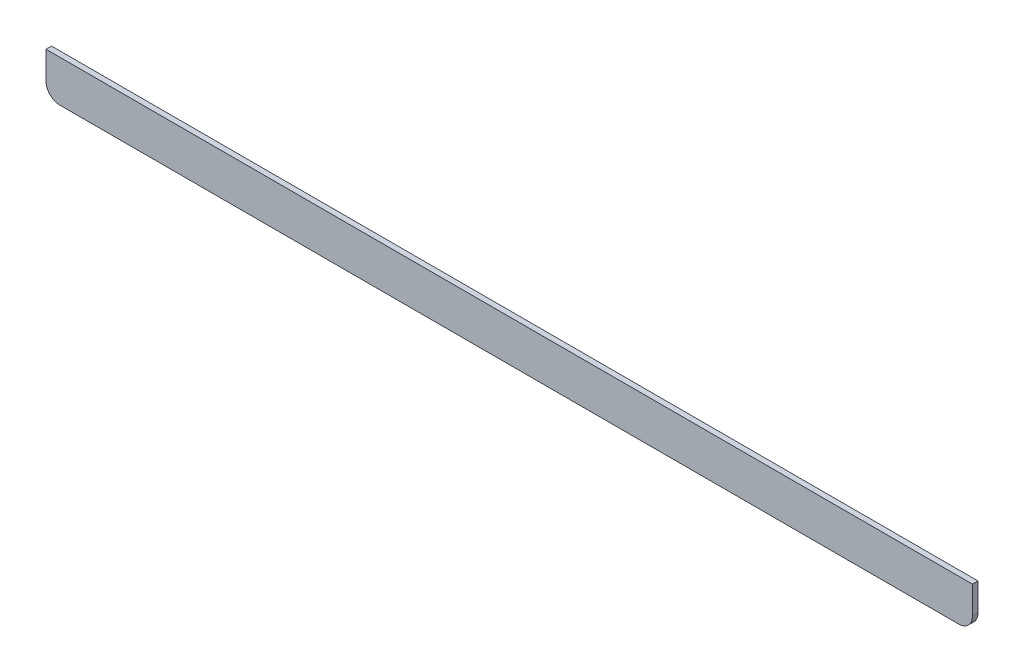
ISO-10303-21;
HEADER;
FILE_DESCRIPTION(('STEP AP214'),'2;1');
FILE_NAME('part.step','',(''),(''),'','','');
FILE_SCHEMA(('AUTOMOTIVE_DESIGN { 1 0 10303 214 1 1 1 1 }'));
ENDSEC;
DATA;
#1=APPLICATION_CONTEXT('core data for automotive mechanical design processes');
#2=APPLICATION_PROTOCOL_DEFINITION('international standard','automotive_design',2000,#1);
#3=PRODUCT_CONTEXT('',#1,'mechanical');
#4=PRODUCT('Part','Part','',(#3));
#5=PRODUCT_RELATED_PRODUCT_CATEGORY('part','',(#4));
#6=PRODUCT_DEFINITION_FORMATION('','',#4);
#7=PRODUCT_DEFINITION_CONTEXT('part definition',#1,'design');
#8=PRODUCT_DEFINITION('design','',#6,#7);
#9=PRODUCT_DEFINITION_SHAPE('','',#8);
#10=(LENGTH_UNIT() NAMED_UNIT(*) SI_UNIT(.MILLI.,.METRE.));
#11=(NAMED_UNIT(*) PLANE_ANGLE_UNIT() SI_UNIT($,.RADIAN.));
#12=(NAMED_UNIT(*) SI_UNIT($,.STERADIAN.) SOLID_ANGLE_UNIT());
#13=UNCERTAINTY_MEASURE_WITH_UNIT(LENGTH_MEASURE(1.E-05),#10,'distance_accuracy_value','');
#14=(GEOMETRIC_REPRESENTATION_CONTEXT(3) GLOBAL_UNCERTAINTY_ASSIGNED_CONTEXT((#13)) GLOBAL_UNIT_ASSIGNED_CONTEXT((#10,
#11,#12)) REPRESENTATION_CONTEXT('',''));
#15=CARTESIAN_POINT('',(0.,0.,0.));
#16=DIRECTION('',(0.,0.,1.));
#17=DIRECTION('',(1.,0.,0.));
#18=AXIS2_PLACEMENT_3D('',#15,#16,#17);
#19=CARTESIAN_POINT('',(335.,-15.,4.));
#20=DIRECTION('',(-1.,0.,0.));
#21=DIRECTION('',(0.,0.,1.));
#22=AXIS2_PLACEMENT_3D('',#19,#20,#21);
#23=PLANE('',#22);
#24=DIRECTION('',(0.,1.,0.));
#25=VECTOR('',#24,1.);
#26=CARTESIAN_POINT('',(335.,-15.,4.));
#27=LINE('',#26,#25);
#28=CARTESIAN_POINT('',(335.,-5.,4.));
#29=VERTEX_POINT('',#28);
#30=CARTESIAN_POINT('',(335.,15.,4.));
#31=VERTEX_POINT('',#30);
#32=EDGE_CURVE('E87',#29,#31,#27,.T.);
#33=ORIENTED_EDGE('',*,*,#32,.F.);
#34=DIRECTION('',(0.,0.,-1.));
#35=VECTOR('',#34,1.);
#36=CARTESIAN_POINT('',(335.,-5.,4.));
#37=LINE('',#36,#35);
#38=CARTESIAN_POINT('',(335.,-5.,0.));
#39=VERTEX_POINT('',#38);
#40=EDGE_CURVE('E110',#29,#39,#37,.T.);
#41=ORIENTED_EDGE('',*,*,#40,.T.);
#42=DIRECTION('',(0.,1.,0.));
#43=VECTOR('',#42,1.);
#44=CARTESIAN_POINT('',(335.,-15.,0.));
#45=LINE('',#44,#43);
#46=CARTESIAN_POINT('',(335.,15.,0.));
#47=VERTEX_POINT('',#46);
#48=EDGE_CURVE('E108',#39,#47,#45,.T.);
#49=ORIENTED_EDGE('',*,*,#48,.T.);
#50=DIRECTION('',(0.,0.,-1.));
#51=VECTOR('',#50,1.);
#52=CARTESIAN_POINT('',(335.,15.,4.));
#53=LINE('',#52,#51);
#54=EDGE_CURVE('E102',#31,#47,#53,.T.);
#55=ORIENTED_EDGE('',*,*,#54,.F.);
#56=EDGE_LOOP('',(#33,#41,#49,#55));
#57=FACE_BOUND('',#56,.T.);
#58=ADVANCED_FACE('F33',(#57),#23,.F.);
#59=CARTESIAN_POINT('',(-335.,15.,4.));
#60=DIRECTION('',(0.,-1.,0.));
#61=DIRECTION('',(0.,0.,-1.));
#62=AXIS2_PLACEMENT_3D('',#59,#60,#61);
#63=PLANE('',#62);
#64=DIRECTION('',(-1.,0.,0.));
#65=VECTOR('',#64,1.);
#66=CARTESIAN_POINT('',(-335.,15.,0.));
#67=LINE('',#66,#65);
#68=CARTESIAN_POINT('',(-335.,15.,0.));
#69=VERTEX_POINT('',#68);
#70=EDGE_CURVE('E137',#47,#69,#67,.T.);
#71=ORIENTED_EDGE('',*,*,#70,.T.);
#72=DIRECTION('',(0.,0.,-1.));
#73=VECTOR('',#72,1.);
#74=CARTESIAN_POINT('',(-335.,15.,4.));
#75=LINE('',#74,#73);
#76=CARTESIAN_POINT('',(-335.,15.,4.));
#77=VERTEX_POINT('',#76);
#78=EDGE_CURVE('E104',#77,#69,#75,.T.);
#79=ORIENTED_EDGE('',*,*,#78,.F.);
#80=DIRECTION('',(-1.,0.,0.));
#81=VECTOR('',#80,1.);
#82=CARTESIAN_POINT('',(-335.,15.,4.));
#83=LINE('',#82,#81);
#84=EDGE_CURVE('E90',#31,#77,#83,.T.);
#85=ORIENTED_EDGE('',*,*,#84,.F.);
#86=ORIENTED_EDGE('',*,*,#54,.T.);
#87=EDGE_LOOP('',(#71,#79,#85,#86));
#88=FACE_BOUND('',#87,.T.);
#89=ADVANCED_FACE('F101',(#88),#63,.F.);
#90=CARTESIAN_POINT('',(-335.,-15.,4.));
#91=DIRECTION('',(1.,0.,0.));
#92=DIRECTION('',(0.,0.,-1.));
#93=AXIS2_PLACEMENT_3D('',#90,#91,#92);
#94=PLANE('',#93);
#95=DIRECTION('',(0.,-1.,0.));
#96=VECTOR('',#95,1.);
#97=CARTESIAN_POINT('',(-335.,-15.,0.));
#98=LINE('',#97,#96);
#99=CARTESIAN_POINT('',(-335.,-5.,0.));
#100=VERTEX_POINT('',#99);
#101=EDGE_CURVE('E135',#69,#100,#98,.T.);
#102=ORIENTED_EDGE('',*,*,#101,.T.);
#103=DIRECTION('',(0.,0.,-1.));
#104=VECTOR('',#103,1.);
#105=CARTESIAN_POINT('',(-335.,-5.,4.));
#106=LINE('',#105,#104);
#107=CARTESIAN_POINT('',(-335.,-5.,4.));
#108=VERTEX_POINT('',#107);
#109=EDGE_CURVE('E11',#100,#108,#106,.F.);
#110=ORIENTED_EDGE('',*,*,#109,.T.);
#111=DIRECTION('',(0.,-1.,0.));
#112=VECTOR('',#111,1.);
#113=CARTESIAN_POINT('',(-335.,-15.,4.));
#114=LINE('',#113,#112);
#115=EDGE_CURVE('E105',#77,#108,#114,.T.);
#116=ORIENTED_EDGE('',*,*,#115,.F.);
#117=ORIENTED_EDGE('',*,*,#78,.T.);
#118=EDGE_LOOP('',(#102,#110,#116,#117));
#119=FACE_BOUND('',#118,.T.);
#120=ADVANCED_FACE('F136',(#119),#94,.F.);
#121=CARTESIAN_POINT('',(-335.,-15.,4.));
#122=DIRECTION('',(0.,1.,0.));
#123=DIRECTION('',(0.,0.,1.));
#124=AXIS2_PLACEMENT_3D('',#121,#122,#123);
#125=PLANE('',#124);
#126=DIRECTION('',(1.,0.,0.));
#127=VECTOR('',#126,1.);
#128=CARTESIAN_POINT('',(-335.,-15.,0.));
#129=LINE('',#128,#127);
#130=CARTESIAN_POINT('',(-325.,-15.,0.));
#131=VERTEX_POINT('',#130);
#132=CARTESIAN_POINT('',(325.,-15.,0.));
#133=VERTEX_POINT('',#132);
#134=EDGE_CURVE('E97',#131,#133,#129,.T.);
#135=ORIENTED_EDGE('',*,*,#134,.T.);
#136=DIRECTION('',(0.,0.,-1.));
#137=VECTOR('',#136,1.);
#138=CARTESIAN_POINT('',(325.,-15.,4.));
#139=LINE('',#138,#137);
#140=CARTESIAN_POINT('',(325.,-15.,4.));
#141=VERTEX_POINT('',#140);
#142=EDGE_CURVE('E54',#133,#141,#139,.F.);
#143=ORIENTED_EDGE('',*,*,#142,.T.);
#144=DIRECTION('',(1.,0.,0.));
#145=VECTOR('',#144,1.);
#146=CARTESIAN_POINT('',(-335.,-15.,4.));
#147=LINE('',#146,#145);
#148=CARTESIAN_POINT('',(-325.,-15.,4.));
#149=VERTEX_POINT('',#148);
#150=EDGE_CURVE('E114',#149,#141,#147,.T.);
#151=ORIENTED_EDGE('',*,*,#150,.F.);
#152=DIRECTION('',(0.,0.,-1.));
#153=VECTOR('',#152,1.);
#154=CARTESIAN_POINT('',(-325.,-15.,4.));
#155=LINE('',#154,#153);
#156=EDGE_CURVE('E121',#149,#131,#155,.T.);
#157=ORIENTED_EDGE('',*,*,#156,.T.);
#158=EDGE_LOOP('',(#135,#143,#151,#157));
#159=FACE_BOUND('',#158,.T.);
#160=ADVANCED_FACE('F129',(#159),#125,.F.);
#161=CARTESIAN_POINT('',(0.,0.,4.));
#162=DIRECTION('',(0.,0.,-1.));
#163=DIRECTION('',(-1.,0.,0.));
#164=AXIS2_PLACEMENT_3D('',#161,#162,#163);
#165=PLANE('',#164);
#166=ORIENTED_EDGE('',*,*,#150,.T.);
#167=CARTESIAN_POINT('',(325.,-5.,4.));
#168=DIRECTION('',(0.,0.,-1.));
#169=DIRECTION('',(-1.,0.,0.));
#170=AXIS2_PLACEMENT_3D('',#167,#168,#169);
#171=CIRCLE('',#170,10.);
#172=EDGE_CURVE('E41',#141,#29,#171,.F.);
#173=ORIENTED_EDGE('',*,*,#172,.T.);
#174=ORIENTED_EDGE('',*,*,#32,.T.);
#175=ORIENTED_EDGE('',*,*,#84,.T.);
#176=ORIENTED_EDGE('',*,*,#115,.T.);
#177=CARTESIAN_POINT('',(-325.,-5.,4.));
#178=DIRECTION('',(0.,0.,-1.));
#179=DIRECTION('',(-1.,0.,0.));
#180=AXIS2_PLACEMENT_3D('',#177,#178,#179);
#181=CIRCLE('',#180,10.);
#182=EDGE_CURVE('E125',#108,#149,#181,.F.);
#183=ORIENTED_EDGE('',*,*,#182,.T.);
#184=EDGE_LOOP('',(#166,#173,#174,#175,#176,#183));
#185=FACE_BOUND('',#184,.T.);
#186=ADVANCED_FACE('F89',(#185),#165,.F.);
#187=CARTESIAN_POINT('',(0.,0.,0.));
#188=DIRECTION('',(0.,0.,-1.));
#189=DIRECTION('',(-1.,0.,0.));
#190=AXIS2_PLACEMENT_3D('',#187,#188,#189);
#191=PLANE('',#190);
#192=ORIENTED_EDGE('',*,*,#48,.F.);
#193=CARTESIAN_POINT('',(325.,-5.,0.));
#194=DIRECTION('',(0.,0.,-1.));
#195=DIRECTION('',(-1.,0.,0.));
#196=AXIS2_PLACEMENT_3D('',#193,#194,#195);
#197=CIRCLE('',#196,10.);
#198=EDGE_CURVE('E119',#39,#133,#197,.T.);
#199=ORIENTED_EDGE('',*,*,#198,.T.);
#200=ORIENTED_EDGE('',*,*,#134,.F.);
#201=CARTESIAN_POINT('',(-325.,-5.,0.));
#202=DIRECTION('',(0.,0.,-1.));
#203=DIRECTION('',(-1.,0.,0.));
#204=AXIS2_PLACEMENT_3D('',#201,#202,#203);
#205=CIRCLE('',#204,10.);
#206=EDGE_CURVE('E112',#131,#100,#205,.T.);
#207=ORIENTED_EDGE('',*,*,#206,.T.);
#208=ORIENTED_EDGE('',*,*,#101,.F.);
#209=ORIENTED_EDGE('',*,*,#70,.F.);
#210=EDGE_LOOP('',(#192,#199,#200,#207,#208,#209));
#211=FACE_BOUND('',#210,.T.);
#212=ADVANCED_FACE('F134',(#211),#191,.T.);
#213=CARTESIAN_POINT('',(325.,-5.,4.));
#214=DIRECTION('',(0.,0.,-1.));
#215=DIRECTION('',(-1.,0.,0.));
#216=AXIS2_PLACEMENT_3D('',#213,#214,#215);
#217=CYLINDRICAL_SURFACE('',#216,10.);
#218=ORIENTED_EDGE('',*,*,#172,.F.);
#219=ORIENTED_EDGE('',*,*,#142,.F.);
#220=ORIENTED_EDGE('',*,*,#198,.F.);
#221=ORIENTED_EDGE('',*,*,#40,.F.);
#222=EDGE_LOOP('',(#218,#219,#220,#221));
#223=FACE_BOUND('',#222,.T.);
#224=ADVANCED_FACE('F143',(#223),#217,.T.);
#225=CARTESIAN_POINT('',(-325.,-5.,4.));
#226=DIRECTION('',(0.,0.,-1.));
#227=DIRECTION('',(-1.,0.,0.));
#228=AXIS2_PLACEMENT_3D('',#225,#226,#227);
#229=CYLINDRICAL_SURFACE('',#228,10.);
#230=ORIENTED_EDGE('',*,*,#182,.F.);
#231=ORIENTED_EDGE('',*,*,#109,.F.);
#232=ORIENTED_EDGE('',*,*,#206,.F.);
#233=ORIENTED_EDGE('',*,*,#156,.F.);
#234=EDGE_LOOP('',(#230,#231,#232,#233));
#235=FACE_BOUND('',#234,.T.);
#236=ADVANCED_FACE('F35',(#235),#229,.T.);
#237=CLOSED_SHELL('',(#58,#89,#120,#160,#186,#212,#224,#236));
#238=MANIFOLD_SOLID_BREP('B2',#237);
#239=ADVANCED_BREP_SHAPE_REPRESENTATION('',(#18,#238),#14);
#240=SHAPE_DEFINITION_REPRESENTATION(#9,#239);
ENDSEC;
END-ISO-10303-21;
